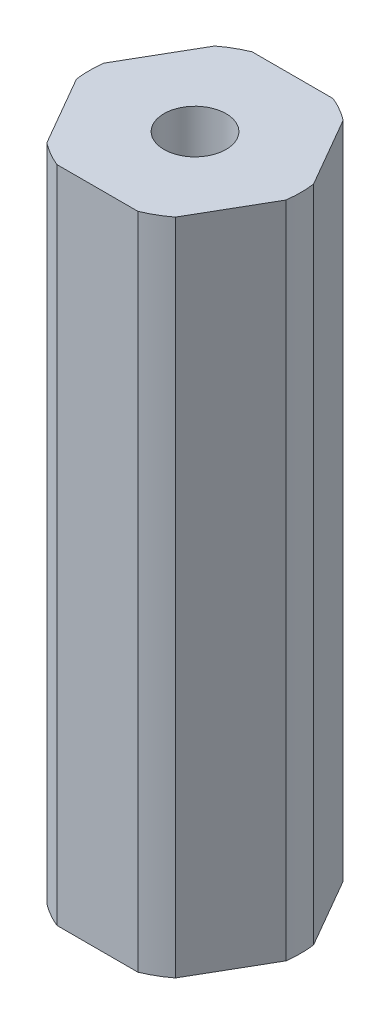
ISO-10303-21;
HEADER;
FILE_DESCRIPTION(('STEP AP214'),'2;1');
FILE_NAME('part.step','',(''),(''),'','','');
FILE_SCHEMA(('AUTOMOTIVE_DESIGN { 1 0 10303 214 1 1 1 1 }'));
ENDSEC;
DATA;
#1=APPLICATION_CONTEXT('core data for automotive mechanical design processes');
#2=APPLICATION_PROTOCOL_DEFINITION('international standard','automotive_design',2000,#1);
#3=PRODUCT_CONTEXT('',#1,'mechanical');
#4=PRODUCT('Part','Part','',(#3));
#5=PRODUCT_RELATED_PRODUCT_CATEGORY('part','',(#4));
#6=PRODUCT_DEFINITION_FORMATION('','',#4);
#7=PRODUCT_DEFINITION_CONTEXT('part definition',#1,'design');
#8=PRODUCT_DEFINITION('design','',#6,#7);
#9=PRODUCT_DEFINITION_SHAPE('','',#8);
#10=(LENGTH_UNIT() NAMED_UNIT(*) SI_UNIT(.MILLI.,.METRE.));
#11=(NAMED_UNIT(*) PLANE_ANGLE_UNIT() SI_UNIT($,.RADIAN.));
#12=(NAMED_UNIT(*) SI_UNIT($,.STERADIAN.) SOLID_ANGLE_UNIT());
#13=UNCERTAINTY_MEASURE_WITH_UNIT(LENGTH_MEASURE(1.E-05),#10,'distance_accuracy_value','');
#14=(GEOMETRIC_REPRESENTATION_CONTEXT(3) GLOBAL_UNCERTAINTY_ASSIGNED_CONTEXT((#13)) GLOBAL_UNIT_ASSIGNED_CONTEXT((#10,
#11,#12)) REPRESENTATION_CONTEXT('',''));
#15=CARTESIAN_POINT('',(0.,0.,0.));
#16=DIRECTION('',(0.,0.,1.));
#17=DIRECTION('',(1.,0.,0.));
#18=AXIS2_PLACEMENT_3D('',#15,#16,#17);
#19=CARTESIAN_POINT('',(5.49926131403119,42.8625,3.175));
#20=DIRECTION('',(0.866025403784439,0.,0.5));
#21=DIRECTION('',(0.5,0.,-0.866025403784439));
#22=AXIS2_PLACEMENT_3D('',#19,#20,#21);
#23=PLANE('',#22);
#24=DIRECTION('',(-0.5,0.,0.866025403784439));
#25=VECTOR('',#24,1.);
#26=CARTESIAN_POINT('',(5.49926131403119,42.8625,3.175));
#27=LINE('',#26,#25);
#28=CARTESIAN_POINT('',(6.81675182633099,42.8625,0.893039494206794));
#29=VERTEX_POINT('',#28);
#30=CARTESIAN_POINT('',(4.18177080173138,42.8625,5.45696050579321));
#31=VERTEX_POINT('',#30);
#32=EDGE_CURVE('E141',#29,#31,#27,.T.);
#33=ORIENTED_EDGE('',*,*,#32,.T.);
#34=DIRECTION('',(0.,-1.,0.));
#35=VECTOR('',#34,1.);
#36=CARTESIAN_POINT('',(4.18177080173138,47.6261797387891,5.45696050579321));
#37=LINE('',#36,#35);
#38=CARTESIAN_POINT('',(4.18177080173138,0.,5.45696050579321));
#39=VERTEX_POINT('',#38);
#40=EDGE_CURVE('E189',#31,#39,#37,.T.);
#41=ORIENTED_EDGE('',*,*,#40,.T.);
#42=DIRECTION('',(-0.5,0.,0.866025403784439));
#43=VECTOR('',#42,1.);
#44=CARTESIAN_POINT('',(5.49926131403119,0.,3.175));
#45=LINE('',#44,#43);
#46=CARTESIAN_POINT('',(6.81675182633099,0.,0.893039494206794));
#47=VERTEX_POINT('',#46);
#48=EDGE_CURVE('E131',#47,#39,#45,.T.);
#49=ORIENTED_EDGE('',*,*,#48,.F.);
#50=DIRECTION('',(0.,-1.,0.));
#51=VECTOR('',#50,1.);
#52=CARTESIAN_POINT('',(6.81675182633099,47.6261797387891,0.893039494206794));
#53=LINE('',#52,#51);
#54=EDGE_CURVE('E180',#47,#29,#53,.F.);
#55=ORIENTED_EDGE('',*,*,#54,.T.);
#56=EDGE_LOOP('',(#33,#41,#49,#55));
#57=FACE_BOUND('',#56,.T.);
#58=ADVANCED_FACE('F17',(#57),#23,.T.);
#59=CARTESIAN_POINT('',(0.,42.8625,6.35));
#60=DIRECTION('',(0.,0.,1.));
#61=DIRECTION('',(1.,0.,0.));
#62=AXIS2_PLACEMENT_3D('',#59,#60,#61);
#63=PLANE('',#62);
#64=DIRECTION('',(-1.,0.,0.));
#65=VECTOR('',#64,1.);
#66=CARTESIAN_POINT('',(0.,42.8625,6.35));
#67=LINE('',#66,#65);
#68=CARTESIAN_POINT('',(2.63498102459961,42.8625,6.35));
#69=VERTEX_POINT('',#68);
#70=CARTESIAN_POINT('',(-2.63498102459961,42.8625,6.35));
#71=VERTEX_POINT('',#70);
#72=EDGE_CURVE('E170',#69,#71,#67,.T.);
#73=ORIENTED_EDGE('',*,*,#72,.T.);
#74=DIRECTION('',(0.,-1.,0.));
#75=VECTOR('',#74,1.);
#76=CARTESIAN_POINT('',(-2.63498102459961,47.6261797387891,6.35));
#77=LINE('',#76,#75);
#78=CARTESIAN_POINT('',(-2.63498102459961,0.,6.35));
#79=VERTEX_POINT('',#78);
#80=EDGE_CURVE('E35',#71,#79,#77,.T.);
#81=ORIENTED_EDGE('',*,*,#80,.T.);
#82=DIRECTION('',(-1.,0.,0.));
#83=VECTOR('',#82,1.);
#84=CARTESIAN_POINT('',(0.,0.,6.35));
#85=LINE('',#84,#83);
#86=CARTESIAN_POINT('',(2.63498102459961,0.,6.35));
#87=VERTEX_POINT('',#86);
#88=EDGE_CURVE('E149',#87,#79,#85,.T.);
#89=ORIENTED_EDGE('',*,*,#88,.F.);
#90=DIRECTION('',(0.,-1.,0.));
#91=VECTOR('',#90,1.);
#92=CARTESIAN_POINT('',(2.63498102459961,47.6261797387891,6.35));
#93=LINE('',#92,#91);
#94=EDGE_CURVE('E193',#87,#69,#93,.F.);
#95=ORIENTED_EDGE('',*,*,#94,.T.);
#96=EDGE_LOOP('',(#73,#81,#89,#95));
#97=FACE_BOUND('',#96,.T.);
#98=ADVANCED_FACE('F251',(#97),#63,.T.);
#99=CARTESIAN_POINT('',(-5.49926131403119,42.8625,3.175));
#100=DIRECTION('',(-0.866025403784439,0.,0.5));
#101=DIRECTION('',(0.5,0.,0.866025403784439));
#102=AXIS2_PLACEMENT_3D('',#99,#100,#101);
#103=PLANE('',#102);
#104=DIRECTION('',(-0.5,0.,-0.866025403784439));
#105=VECTOR('',#104,1.);
#106=CARTESIAN_POINT('',(-5.49926131403119,42.8625,3.175));
#107=LINE('',#106,#105);
#108=CARTESIAN_POINT('',(-4.18177080173138,42.8625,5.45696050579321));
#109=VERTEX_POINT('',#108);
#110=CARTESIAN_POINT('',(-6.81675182633099,42.8625,0.893039494206794));
#111=VERTEX_POINT('',#110);
#112=EDGE_CURVE('E166',#109,#111,#107,.T.);
#113=ORIENTED_EDGE('',*,*,#112,.T.);
#114=DIRECTION('',(0.,-1.,0.));
#115=VECTOR('',#114,1.);
#116=CARTESIAN_POINT('',(-6.81675182633099,47.6261797387891,0.893039494206794));
#117=LINE('',#116,#115);
#118=CARTESIAN_POINT('',(-6.81675182633099,0.,0.893039494206794));
#119=VERTEX_POINT('',#118);
#120=EDGE_CURVE('E43',#111,#119,#117,.T.);
#121=ORIENTED_EDGE('',*,*,#120,.T.);
#122=DIRECTION('',(-0.5,0.,-0.866025403784439));
#123=VECTOR('',#122,1.);
#124=CARTESIAN_POINT('',(-5.49926131403119,0.,3.175));
#125=LINE('',#124,#123);
#126=CARTESIAN_POINT('',(-4.18177080173138,0.,5.45696050579321));
#127=VERTEX_POINT('',#126);
#128=EDGE_CURVE('E143',#127,#119,#125,.T.);
#129=ORIENTED_EDGE('',*,*,#128,.F.);
#130=DIRECTION('',(0.,-1.,0.));
#131=VECTOR('',#130,1.);
#132=CARTESIAN_POINT('',(-4.18177080173138,47.6261797387891,5.45696050579321));
#133=LINE('',#132,#131);
#134=EDGE_CURVE('E200',#127,#109,#133,.F.);
#135=ORIENTED_EDGE('',*,*,#134,.T.);
#136=EDGE_LOOP('',(#113,#121,#129,#135));
#137=FACE_BOUND('',#136,.T.);
#138=ADVANCED_FACE('F256',(#137),#103,.T.);
#139=CARTESIAN_POINT('',(-5.49926131403119,42.8625,-3.175));
#140=DIRECTION('',(-0.866025403784439,0.,-0.5));
#141=DIRECTION('',(-0.5,0.,0.866025403784439));
#142=AXIS2_PLACEMENT_3D('',#139,#140,#141);
#143=PLANE('',#142);
#144=DIRECTION('',(0.5,0.,-0.866025403784439));
#145=VECTOR('',#144,1.);
#146=CARTESIAN_POINT('',(-5.49926131403119,42.8625,-3.175));
#147=LINE('',#146,#145);
#148=CARTESIAN_POINT('',(-6.81675182633099,42.8625,-0.893039494206793));
#149=VERTEX_POINT('',#148);
#150=CARTESIAN_POINT('',(-4.18177080173138,42.8625,-5.45696050579321));
#151=VERTEX_POINT('',#150);
#152=EDGE_CURVE('E162',#149,#151,#147,.T.);
#153=ORIENTED_EDGE('',*,*,#152,.T.);
#154=DIRECTION('',(0.,-1.,0.));
#155=VECTOR('',#154,1.);
#156=CARTESIAN_POINT('',(-4.18177080173138,47.6261797387891,-5.45696050579321));
#157=LINE('',#156,#155);
#158=CARTESIAN_POINT('',(-4.18177080173138,0.,-5.45696050579321));
#159=VERTEX_POINT('',#158);
#160=EDGE_CURVE('E212',#151,#159,#157,.T.);
#161=ORIENTED_EDGE('',*,*,#160,.T.);
#162=DIRECTION('',(0.5,0.,-0.866025403784439));
#163=VECTOR('',#162,1.);
#164=CARTESIAN_POINT('',(-5.49926131403119,0.,-3.175));
#165=LINE('',#164,#163);
#166=CARTESIAN_POINT('',(-6.81675182633099,0.,-0.893039494206793));
#167=VERTEX_POINT('',#166);
#168=EDGE_CURVE('E137',#167,#159,#165,.T.);
#169=ORIENTED_EDGE('',*,*,#168,.F.);
#170=DIRECTION('',(0.,-1.,0.));
#171=VECTOR('',#170,1.);
#172=CARTESIAN_POINT('',(-6.81675182633099,47.6261797387891,-0.89303949420679));
#173=LINE('',#172,#171);
#174=EDGE_CURVE('E207',#167,#149,#173,.F.);
#175=ORIENTED_EDGE('',*,*,#174,.T.);
#176=EDGE_LOOP('',(#153,#161,#169,#175));
#177=FACE_BOUND('',#176,.T.);
#178=ADVANCED_FACE('F309',(#177),#143,.T.);
#179=CARTESIAN_POINT('',(0.,42.8625,-6.35));
#180=DIRECTION('',(0.,0.,-1.));
#181=DIRECTION('',(-1.,0.,0.));
#182=AXIS2_PLACEMENT_3D('',#179,#180,#181);
#183=PLANE('',#182);
#184=DIRECTION('',(1.,0.,0.));
#185=VECTOR('',#184,1.);
#186=CARTESIAN_POINT('',(0.,42.8625,-6.35));
#187=LINE('',#186,#185);
#188=CARTESIAN_POINT('',(-2.63498102459961,42.8625,-6.35));
#189=VERTEX_POINT('',#188);
#190=CARTESIAN_POINT('',(2.63498102459961,42.8625,-6.35));
#191=VERTEX_POINT('',#190);
#192=EDGE_CURVE('E129',#189,#191,#187,.T.);
#193=ORIENTED_EDGE('',*,*,#192,.T.);
#194=DIRECTION('',(0.,-1.,0.));
#195=VECTOR('',#194,1.);
#196=CARTESIAN_POINT('',(2.63498102459961,47.6261797387891,-6.35));
#197=LINE('',#196,#195);
#198=CARTESIAN_POINT('',(2.63498102459961,0.,-6.35));
#199=VERTEX_POINT('',#198);
#200=EDGE_CURVE('E110',#191,#199,#197,.T.);
#201=ORIENTED_EDGE('',*,*,#200,.T.);
#202=DIRECTION('',(1.,0.,0.));
#203=VECTOR('',#202,1.);
#204=CARTESIAN_POINT('',(0.,0.,-6.35));
#205=LINE('',#204,#203);
#206=CARTESIAN_POINT('',(-2.63498102459961,0.,-6.35));
#207=VERTEX_POINT('',#206);
#208=EDGE_CURVE('E127',#207,#199,#205,.T.);
#209=ORIENTED_EDGE('',*,*,#208,.F.);
#210=DIRECTION('',(0.,-1.,0.));
#211=VECTOR('',#210,1.);
#212=CARTESIAN_POINT('',(-2.63498102459961,47.6261797387891,-6.35));
#213=LINE('',#212,#211);
#214=EDGE_CURVE('E216',#207,#189,#213,.F.);
#215=ORIENTED_EDGE('',*,*,#214,.T.);
#216=EDGE_LOOP('',(#193,#201,#209,#215));
#217=FACE_BOUND('',#216,.T.);
#218=ADVANCED_FACE('F125',(#217),#183,.T.);
#219=CARTESIAN_POINT('',(5.49926131403119,42.8625,-3.175));
#220=DIRECTION('',(0.866025403784438,0.,-0.5));
#221=DIRECTION('',(-0.5,0.,-0.866025403784439));
#222=AXIS2_PLACEMENT_3D('',#219,#220,#221);
#223=PLANE('',#222);
#224=DIRECTION('',(0.5,0.,0.866025403784439));
#225=VECTOR('',#224,1.);
#226=CARTESIAN_POINT('',(5.49926131403119,42.8625,-3.175));
#227=LINE('',#226,#225);
#228=CARTESIAN_POINT('',(4.18177080173138,42.8625,-5.45696050579321));
#229=VERTEX_POINT('',#228);
#230=CARTESIAN_POINT('',(6.81675182633099,42.8625,-0.893039494206797));
#231=VERTEX_POINT('',#230);
#232=EDGE_CURVE('E156',#229,#231,#227,.T.);
#233=ORIENTED_EDGE('',*,*,#232,.T.);
#234=DIRECTION('',(0.,-1.,0.));
#235=VECTOR('',#234,1.);
#236=CARTESIAN_POINT('',(6.81675182633099,47.6261797387891,-0.893039494206793));
#237=LINE('',#236,#235);
#238=CARTESIAN_POINT('',(6.81675182633099,0.,-0.893039494206797));
#239=VERTEX_POINT('',#238);
#240=EDGE_CURVE('E184',#231,#239,#237,.T.);
#241=ORIENTED_EDGE('',*,*,#240,.T.);
#242=DIRECTION('',(0.5,0.,0.866025403784439));
#243=VECTOR('',#242,1.);
#244=CARTESIAN_POINT('',(5.49926131403119,0.,-3.175));
#245=LINE('',#244,#243);
#246=CARTESIAN_POINT('',(4.18177080173138,0.,-5.45696050579321));
#247=VERTEX_POINT('',#246);
#248=EDGE_CURVE('E20',#247,#239,#245,.T.);
#249=ORIENTED_EDGE('',*,*,#248,.F.);
#250=DIRECTION('',(0.,-1.,0.));
#251=VECTOR('',#250,1.);
#252=CARTESIAN_POINT('',(4.18177080173138,47.6261797387891,-5.45696050579321));
#253=LINE('',#252,#251);
#254=EDGE_CURVE('E113',#247,#229,#253,.F.);
#255=ORIENTED_EDGE('',*,*,#254,.T.);
#256=EDGE_LOOP('',(#233,#241,#249,#255));
#257=FACE_BOUND('',#256,.T.);
#258=ADVANCED_FACE('F246',(#257),#223,.T.);
#259=CARTESIAN_POINT('',(0.,42.8625,0.));
#260=DIRECTION('',(0.,-1.,0.));
#261=DIRECTION('',(1.,0.,0.));
#262=AXIS2_PLACEMENT_3D('',#259,#260,#261);
#263=PLANE('',#262);
#264=CARTESIAN_POINT('',(0.,42.8625,0.));
#265=DIRECTION('',(0.,-1.,0.));
#266=DIRECTION('',(0.,0.,-1.));
#267=AXIS2_PLACEMENT_3D('',#264,#265,#266);
#268=CIRCLE('',#267,2.0193);
#269=CARTESIAN_POINT('',(0.,42.8625,-2.0193));
#270=VERTEX_POINT('',#269);
#271=EDGE_CURVE('E120',#270,#270,#268,.T.);
#272=ORIENTED_EDGE('',*,*,#271,.T.);
#273=EDGE_LOOP('',(#272));
#274=FACE_BOUND('',#273,.T.);
#275=CARTESIAN_POINT('',(0.,42.8625,0.));
#276=DIRECTION('',(0.,-1.,0.));
#277=DIRECTION('',(0.,0.,-1.));
#278=AXIS2_PLACEMENT_3D('',#275,#276,#277);
#279=CIRCLE('',#278,6.875);
#280=EDGE_CURVE('E179',#191,#229,#279,.T.);
#281=ORIENTED_EDGE('',*,*,#280,.F.);
#282=ORIENTED_EDGE('',*,*,#192,.F.);
#283=EDGE_CURVE('E119',#151,#189,#279,.T.);
#284=ORIENTED_EDGE('',*,*,#283,.F.);
#285=ORIENTED_EDGE('',*,*,#152,.F.);
#286=EDGE_CURVE('E211',#111,#149,#279,.T.);
#287=ORIENTED_EDGE('',*,*,#286,.F.);
#288=ORIENTED_EDGE('',*,*,#112,.F.);
#289=EDGE_CURVE('E204',#71,#109,#279,.T.);
#290=ORIENTED_EDGE('',*,*,#289,.F.);
#291=ORIENTED_EDGE('',*,*,#72,.F.);
#292=EDGE_CURVE('E197',#31,#69,#279,.T.);
#293=ORIENTED_EDGE('',*,*,#292,.F.);
#294=ORIENTED_EDGE('',*,*,#32,.F.);
#295=EDGE_CURVE('E188',#231,#29,#279,.T.);
#296=ORIENTED_EDGE('',*,*,#295,.F.);
#297=ORIENTED_EDGE('',*,*,#232,.F.);
#298=EDGE_LOOP('',(#281,#282,#284,#285,#287,#288,#290,#291,#293,#294,#296,#297));
#299=FACE_BOUND('',#298,.T.);
#300=ADVANCED_FACE('F235',(#274,#299),#263,.F.);
#301=CARTESIAN_POINT('',(0.,0.,0.));
#302=DIRECTION('',(0.,-1.,0.));
#303=DIRECTION('',(1.,0.,0.));
#304=AXIS2_PLACEMENT_3D('',#301,#302,#303);
#305=PLANE('',#304);
#306=CARTESIAN_POINT('',(0.,0.,0.));
#307=DIRECTION('',(0.,-1.,0.));
#308=DIRECTION('',(0.,0.,-1.));
#309=AXIS2_PLACEMENT_3D('',#306,#307,#308);
#310=CIRCLE('',#309,2.0193);
#311=CARTESIAN_POINT('',(0.,0.,-2.0193));
#312=VERTEX_POINT('',#311);
#313=EDGE_CURVE('E224',#312,#312,#310,.T.);
#314=ORIENTED_EDGE('',*,*,#313,.F.);
#315=EDGE_LOOP('',(#314));
#316=FACE_BOUND('',#315,.T.);
#317=ORIENTED_EDGE('',*,*,#208,.T.);
#318=CARTESIAN_POINT('',(0.,0.,0.));
#319=DIRECTION('',(0.,-1.,0.));
#320=DIRECTION('',(0.,0.,-1.));
#321=AXIS2_PLACEMENT_3D('',#318,#319,#320);
#322=CIRCLE('',#321,6.875);
#323=EDGE_CURVE('E28',#199,#247,#322,.T.);
#324=ORIENTED_EDGE('',*,*,#323,.T.);
#325=ORIENTED_EDGE('',*,*,#248,.T.);
#326=EDGE_CURVE('E11',#239,#47,#322,.T.);
#327=ORIENTED_EDGE('',*,*,#326,.T.);
#328=ORIENTED_EDGE('',*,*,#48,.T.);
#329=EDGE_CURVE('E26',#39,#87,#322,.T.);
#330=ORIENTED_EDGE('',*,*,#329,.T.);
#331=ORIENTED_EDGE('',*,*,#88,.T.);
#332=EDGE_CURVE('E404',#79,#127,#322,.T.);
#333=ORIENTED_EDGE('',*,*,#332,.T.);
#334=ORIENTED_EDGE('',*,*,#128,.T.);
#335=EDGE_CURVE('E405',#119,#167,#322,.T.);
#336=ORIENTED_EDGE('',*,*,#335,.T.);
#337=ORIENTED_EDGE('',*,*,#168,.T.);
#338=EDGE_CURVE('E121',#159,#207,#322,.T.);
#339=ORIENTED_EDGE('',*,*,#338,.T.);
#340=EDGE_LOOP('',(#317,#324,#325,#327,#328,#330,#331,#333,#334,#336,#337,#339));
#341=FACE_BOUND('',#340,.T.);
#342=ADVANCED_FACE('F134',(#316,#341),#305,.T.);
#343=CARTESIAN_POINT('',(0.,47.6261797387891,0.));
#344=DIRECTION('',(0.,-1.,0.));
#345=DIRECTION('',(0.,0.,-1.));
#346=AXIS2_PLACEMENT_3D('',#343,#344,#345);
#347=CYLINDRICAL_SURFACE('',#346,6.875);
#348=ORIENTED_EDGE('',*,*,#283,.T.);
#349=ORIENTED_EDGE('',*,*,#214,.F.);
#350=ORIENTED_EDGE('',*,*,#338,.F.);
#351=ORIENTED_EDGE('',*,*,#160,.F.);
#352=EDGE_LOOP('',(#348,#349,#350,#351));
#353=FACE_BOUND('',#352,.T.);
#354=ADVANCED_FACE('F234',(#353),#347,.T.);
#355=ORIENTED_EDGE('',*,*,#286,.T.);
#356=ORIENTED_EDGE('',*,*,#174,.F.);
#357=ORIENTED_EDGE('',*,*,#335,.F.);
#358=ORIENTED_EDGE('',*,*,#120,.F.);
#359=EDGE_LOOP('',(#355,#356,#357,#358));
#360=FACE_BOUND('',#359,.T.);
#361=ADVANCED_FACE('F243',(#360),#347,.T.);
#362=ORIENTED_EDGE('',*,*,#289,.T.);
#363=ORIENTED_EDGE('',*,*,#134,.F.);
#364=ORIENTED_EDGE('',*,*,#332,.F.);
#365=ORIENTED_EDGE('',*,*,#80,.F.);
#366=EDGE_LOOP('',(#362,#363,#364,#365));
#367=FACE_BOUND('',#366,.T.);
#368=ADVANCED_FACE('F278',(#367),#347,.T.);
#369=ORIENTED_EDGE('',*,*,#292,.T.);
#370=ORIENTED_EDGE('',*,*,#94,.F.);
#371=ORIENTED_EDGE('',*,*,#329,.F.);
#372=ORIENTED_EDGE('',*,*,#40,.F.);
#373=EDGE_LOOP('',(#369,#370,#371,#372));
#374=FACE_BOUND('',#373,.T.);
#375=ADVANCED_FACE('F274',(#374),#347,.T.);
#376=ORIENTED_EDGE('',*,*,#326,.F.);
#377=ORIENTED_EDGE('',*,*,#240,.F.);
#378=ORIENTED_EDGE('',*,*,#295,.T.);
#379=ORIENTED_EDGE('',*,*,#54,.F.);
#380=EDGE_LOOP('',(#376,#377,#378,#379));
#381=FACE_BOUND('',#380,.T.);
#382=ADVANCED_FACE('F272',(#381),#347,.T.);
#383=ORIENTED_EDGE('',*,*,#280,.T.);
#384=ORIENTED_EDGE('',*,*,#254,.F.);
#385=ORIENTED_EDGE('',*,*,#323,.F.);
#386=ORIENTED_EDGE('',*,*,#200,.F.);
#387=EDGE_LOOP('',(#383,#384,#385,#386));
#388=FACE_BOUND('',#387,.T.);
#389=ADVANCED_FACE('F109',(#388),#347,.T.);
#390=CARTESIAN_POINT('',(0.,46.7812134357235,0.));
#391=DIRECTION('',(0.,-1.,0.));
#392=DIRECTION('',(0.,0.,-1.));
#393=AXIS2_PLACEMENT_3D('',#390,#391,#392);
#394=CYLINDRICAL_SURFACE('',#393,2.0193);
#395=ORIENTED_EDGE('',*,*,#313,.T.);
#396=EDGE_LOOP('',(#395));
#397=FACE_BOUND('',#396,.T.);
#398=ORIENTED_EDGE('',*,*,#271,.F.);
#399=EDGE_LOOP('',(#398));
#400=FACE_BOUND('',#399,.T.);
#401=ADVANCED_FACE('F230',(#397,#400),#394,.F.);
#402=CLOSED_SHELL('',(#58,#98,#138,#178,#218,#258,#300,#342,#354,#361,#368,#375,#382,#389,#401));
#403=MANIFOLD_SOLID_BREP('B1',#402);
#404=ADVANCED_BREP_SHAPE_REPRESENTATION('',(#18,#403),#14);
#405=SHAPE_DEFINITION_REPRESENTATION(#9,#404);
ENDSEC;
END-ISO-10303-21;
